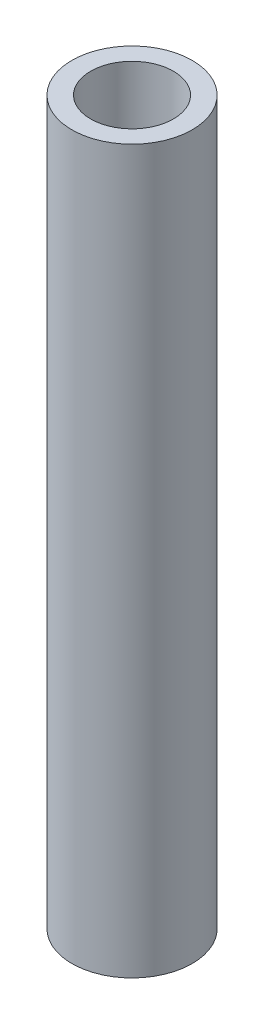
ISO-10303-21;
HEADER;
FILE_DESCRIPTION(('STEP AP214'),'2;1');
FILE_NAME('part.step','',(''),(''),'','','');
FILE_SCHEMA(('AUTOMOTIVE_DESIGN { 1 0 10303 214 1 1 1 1 }'));
ENDSEC;
DATA;
#1=APPLICATION_CONTEXT('core data for automotive mechanical design processes');
#2=APPLICATION_PROTOCOL_DEFINITION('international standard','automotive_design',2000,#1);
#3=PRODUCT_CONTEXT('',#1,'mechanical');
#4=PRODUCT('Part','Part','',(#3));
#5=PRODUCT_RELATED_PRODUCT_CATEGORY('part','',(#4));
#6=PRODUCT_DEFINITION_FORMATION('','',#4);
#7=PRODUCT_DEFINITION_CONTEXT('part definition',#1,'design');
#8=PRODUCT_DEFINITION('design','',#6,#7);
#9=PRODUCT_DEFINITION_SHAPE('','',#8);
#10=(LENGTH_UNIT() NAMED_UNIT(*) SI_UNIT(.MILLI.,.METRE.));
#11=(NAMED_UNIT(*) PLANE_ANGLE_UNIT() SI_UNIT($,.RADIAN.));
#12=(NAMED_UNIT(*) SI_UNIT($,.STERADIAN.) SOLID_ANGLE_UNIT());
#13=UNCERTAINTY_MEASURE_WITH_UNIT(LENGTH_MEASURE(1.E-05),#10,'distance_accuracy_value','');
#14=(GEOMETRIC_REPRESENTATION_CONTEXT(3) GLOBAL_UNCERTAINTY_ASSIGNED_CONTEXT((#13)) GLOBAL_UNIT_ASSIGNED_CONTEXT((#10,
#11,#12)) REPRESENTATION_CONTEXT('',''));
#15=CARTESIAN_POINT('',(0.,0.,0.));
#16=DIRECTION('',(0.,0.,1.));
#17=DIRECTION('',(1.,0.,0.));
#18=AXIS2_PLACEMENT_3D('',#15,#16,#17);
#19=CARTESIAN_POINT('',(0.,19.05,0.));
#20=DIRECTION('',(0.,-1.,0.));
#21=DIRECTION('',(0.,0.,-1.));
#22=AXIS2_PLACEMENT_3D('',#19,#20,#21);
#23=CYLINDRICAL_SURFACE('',#22,1.5875);
#24=CARTESIAN_POINT('',(0.,19.05,0.));
#25=DIRECTION('',(0.,1.,0.));
#26=DIRECTION('',(0.,0.,1.));
#27=AXIS2_PLACEMENT_3D('',#24,#25,#26);
#28=CIRCLE('',#27,1.5875);
#29=CARTESIAN_POINT('',(0.,19.05,-1.5875));
#30=VERTEX_POINT('',#29);
#31=EDGE_CURVE('E10',#30,#30,#28,.T.);
#32=CARTESIAN_POINT('',(0.,0.,0.));
#33=DIRECTION('',(0.,1.,0.));
#34=DIRECTION('',(0.,0.,1.));
#35=AXIS2_PLACEMENT_3D('',#32,#33,#34);
#36=CIRCLE('',#35,1.5875);
#37=CARTESIAN_POINT('',(0.,0.,-1.5875));
#38=VERTEX_POINT('',#37);
#39=EDGE_CURVE('E34',#38,#38,#36,.T.);
#40=CARTESIAN_POINT('',(0.,19.05,-1.5875));
#41=CARTESIAN_POINT('',(0.,18.8515625,-1.5875));
#42=CARTESIAN_POINT('',(0.,18.653125,-1.5875));
#43=CARTESIAN_POINT('',(0.,18.25625,-1.5875));
#44=CARTESIAN_POINT('',(0.,18.0578125,-1.5875));
#45=CARTESIAN_POINT('',(0.,17.6609375,-1.5875));
#46=CARTESIAN_POINT('',(0.,17.4625,-1.5875));
#47=CARTESIAN_POINT('',(0.,17.065625,-1.5875));
#48=CARTESIAN_POINT('',(0.,16.8671875,-1.5875));
#49=CARTESIAN_POINT('',(0.,16.4703125,-1.5875));
#50=CARTESIAN_POINT('',(0.,16.271875,-1.5875));
#51=CARTESIAN_POINT('',(0.,15.875,-1.5875));
#52=CARTESIAN_POINT('',(0.,15.6765625,-1.5875));
#53=CARTESIAN_POINT('',(0.,15.2796875,-1.5875));
#54=CARTESIAN_POINT('',(0.,15.08125,-1.5875));
#55=CARTESIAN_POINT('',(0.,14.684375,-1.5875));
#56=CARTESIAN_POINT('',(0.,14.4859375,-1.5875));
#57=CARTESIAN_POINT('',(0.,14.0890625,-1.5875));
#58=CARTESIAN_POINT('',(0.,13.890625,-1.5875));
#59=CARTESIAN_POINT('',(0.,13.49375,-1.5875));
#60=CARTESIAN_POINT('',(0.,13.2953125,-1.5875));
#61=CARTESIAN_POINT('',(0.,12.8984375,-1.5875));
#62=CARTESIAN_POINT('',(0.,12.7,-1.5875));
#63=CARTESIAN_POINT('',(0.,12.303125,-1.5875));
#64=CARTESIAN_POINT('',(0.,12.1046875,-1.5875));
#65=CARTESIAN_POINT('',(0.,11.7078125,-1.5875));
#66=CARTESIAN_POINT('',(0.,11.509375,-1.5875));
#67=CARTESIAN_POINT('',(0.,11.1125,-1.5875));
#68=CARTESIAN_POINT('',(0.,10.9140625,-1.5875));
#69=CARTESIAN_POINT('',(0.,10.5171875,-1.5875));
#70=CARTESIAN_POINT('',(0.,10.31875,-1.5875));
#71=CARTESIAN_POINT('',(0.,9.921875,-1.5875));
#72=CARTESIAN_POINT('',(0.,9.7234375,-1.5875));
#73=CARTESIAN_POINT('',(0.,9.3265625,-1.5875));
#74=CARTESIAN_POINT('',(0.,9.128125,-1.5875));
#75=CARTESIAN_POINT('',(0.,8.73125,-1.5875));
#76=CARTESIAN_POINT('',(0.,8.5328125,-1.5875));
#77=CARTESIAN_POINT('',(0.,8.1359375,-1.5875));
#78=CARTESIAN_POINT('',(0.,7.9375,-1.5875));
#79=CARTESIAN_POINT('',(0.,7.540625,-1.5875));
#80=CARTESIAN_POINT('',(0.,7.3421875,-1.5875));
#81=CARTESIAN_POINT('',(0.,6.9453125,-1.5875));
#82=CARTESIAN_POINT('',(0.,6.746875,-1.5875));
#83=CARTESIAN_POINT('',(0.,6.35,-1.5875));
#84=CARTESIAN_POINT('',(0.,6.1515625,-1.5875));
#85=CARTESIAN_POINT('',(0.,5.7546875,-1.5875));
#86=CARTESIAN_POINT('',(0.,5.55625,-1.5875));
#87=CARTESIAN_POINT('',(0.,5.159375,-1.5875));
#88=CARTESIAN_POINT('',(0.,4.9609375,-1.5875));
#89=CARTESIAN_POINT('',(0.,4.5640625,-1.5875));
#90=CARTESIAN_POINT('',(0.,4.365625,-1.5875));
#91=CARTESIAN_POINT('',(0.,3.96875,-1.5875));
#92=CARTESIAN_POINT('',(0.,3.7703125,-1.5875));
#93=CARTESIAN_POINT('',(0.,3.3734375,-1.5875));
#94=CARTESIAN_POINT('',(0.,3.175,-1.5875));
#95=CARTESIAN_POINT('',(0.,2.778125,-1.5875));
#96=CARTESIAN_POINT('',(0.,2.5796875,-1.5875));
#97=CARTESIAN_POINT('',(0.,2.1828125,-1.5875));
#98=CARTESIAN_POINT('',(0.,1.984375,-1.5875));
#99=CARTESIAN_POINT('',(0.,1.5875,-1.5875));
#100=CARTESIAN_POINT('',(0.,1.3890625,-1.5875));
#101=CARTESIAN_POINT('',(0.,0.992187500000001,-1.5875));
#102=CARTESIAN_POINT('',(0.,0.793750000000001,-1.5875));
#103=CARTESIAN_POINT('',(0.,0.396875,-1.5875));
#104=CARTESIAN_POINT('',(0.,0.1984375,-1.5875));
#105=CARTESIAN_POINT('',(0.,0.,-1.5875));
#106=B_SPLINE_CURVE_WITH_KNOTS('',3,(#40,#41,#42,#43,#44,#45,#46,#47,#48,#49,#50,#51,#52,#53,
#54,#55,#56,#57,#58,#59,#60,#61,#62,#63,#64,#65,#66,#67,#68,#69,#70,#71,#72,#73,#74,#75,#76,#77,
#78,#79,#80,#81,#82,#83,#84,#85,#86,#87,#88,#89,#90,#91,#92,#93,#94,#95,#96,#97,#98,#99,#100,
#101,#102,#103,#104,#105),.UNSPECIFIED.,.F.,.F.,(4,2,2,2,2,2,2,2,2,2,2,2,2,2,2,2,2,2,2,2,2,2,2,
2,2,2,2,2,2,2,2,2,4),(0.,0.595312499999997,1.190625,1.7859375,2.38125,2.9765625,3.571875,
4.1671875,4.7625,5.3578125,5.953125,6.5484375,7.14375,7.7390625,8.334375,8.9296875,9.525,
10.1203125,10.715625,11.3109375,11.90625,12.5015625,13.096875,13.6921875,14.2875,14.8828125,
15.478125,16.0734375,16.66875,17.2640625,17.859375,18.4546875,19.05),.UNSPECIFIED.);
#107=EDGE_CURVE('BSEAM31',#30,#38,#106,.T.);
#108=ORIENTED_EDGE('',*,*,#31,.F.);
#109=ORIENTED_EDGE('',*,*,#39,.T.);
#110=ORIENTED_EDGE('',*,*,#107,.T.);
#111=ORIENTED_EDGE('',*,*,#107,.F.);
#112=EDGE_LOOP('',(#108,#110,#109,#111));
#113=FACE_BOUND('',#112,.T.);
#114=ADVANCED_FACE('F31',(#113),#23,.T.);
#115=CARTESIAN_POINT('',(0.,19.05,0.));
#116=DIRECTION('',(0.,1.,0.));
#117=DIRECTION('',(0.,0.,1.));
#118=AXIS2_PLACEMENT_3D('',#115,#116,#117);
#119=PLANE('',#118);
#120=CARTESIAN_POINT('',(0.,19.05,0.));
#121=DIRECTION('',(0.,1.,0.));
#122=DIRECTION('',(0.,0.,1.));
#123=AXIS2_PLACEMENT_3D('',#120,#121,#122);
#124=CIRCLE('',#123,1.09219999999999);
#125=CARTESIAN_POINT('',(0.,19.05,1.09219999999999));
#126=VERTEX_POINT('',#125);
#127=EDGE_CURVE('E45',#126,#126,#124,.T.);
#128=ORIENTED_EDGE('',*,*,#127,.F.);
#129=EDGE_LOOP('',(#128));
#130=FACE_BOUND('',#129,.T.);
#131=ORIENTED_EDGE('',*,*,#31,.T.);
#132=EDGE_LOOP('',(#131));
#133=FACE_BOUND('',#132,.T.);
#134=ADVANCED_FACE('F51',(#130,#133),#119,.T.);
#135=CARTESIAN_POINT('',(0.,0.,0.));
#136=DIRECTION('',(0.,1.,0.));
#137=DIRECTION('',(0.,0.,1.));
#138=AXIS2_PLACEMENT_3D('',#135,#136,#137);
#139=PLANE('',#138);
#140=CARTESIAN_POINT('',(0.,0.,0.));
#141=DIRECTION('',(0.,1.,0.));
#142=DIRECTION('',(0.,0.,1.));
#143=AXIS2_PLACEMENT_3D('',#140,#141,#142);
#144=CIRCLE('',#143,1.0922);
#145=CARTESIAN_POINT('',(0.,0.,1.0922));
#146=VERTEX_POINT('',#145);
#147=EDGE_CURVE('E41',#146,#146,#144,.T.);
#148=ORIENTED_EDGE('',*,*,#147,.T.);
#149=EDGE_LOOP('',(#148));
#150=FACE_BOUND('',#149,.T.);
#151=ORIENTED_EDGE('',*,*,#39,.F.);
#152=EDGE_LOOP('',(#151));
#153=FACE_BOUND('',#152,.T.);
#154=ADVANCED_FACE('F53',(#150,#153),#139,.F.);
#155=CARTESIAN_POINT('',(0.,19.05,0.));
#156=DIRECTION('',(0.,1.,0.));
#157=DIRECTION('',(0.,0.,1.));
#158=AXIS2_PLACEMENT_3D('',#155,#156,#157);
#159=CYLINDRICAL_SURFACE('',#158,1.09219999999999);
#160=ORIENTED_EDGE('',*,*,#147,.F.);
#161=EDGE_LOOP('',(#160));
#162=FACE_BOUND('',#161,.T.);
#163=ORIENTED_EDGE('',*,*,#127,.T.);
#164=EDGE_LOOP('',(#163));
#165=FACE_BOUND('',#164,.T.);
#166=ADVANCED_FACE('F49',(#162,#165),#159,.F.);
#167=CLOSED_SHELL('',(#114,#134,#154,#166));
#168=MANIFOLD_SOLID_BREP('B2',#167);
#169=ADVANCED_BREP_SHAPE_REPRESENTATION('',(#18,#168),#14);
#170=SHAPE_DEFINITION_REPRESENTATION(#9,#169);
ENDSEC;
END-ISO-10303-21;
